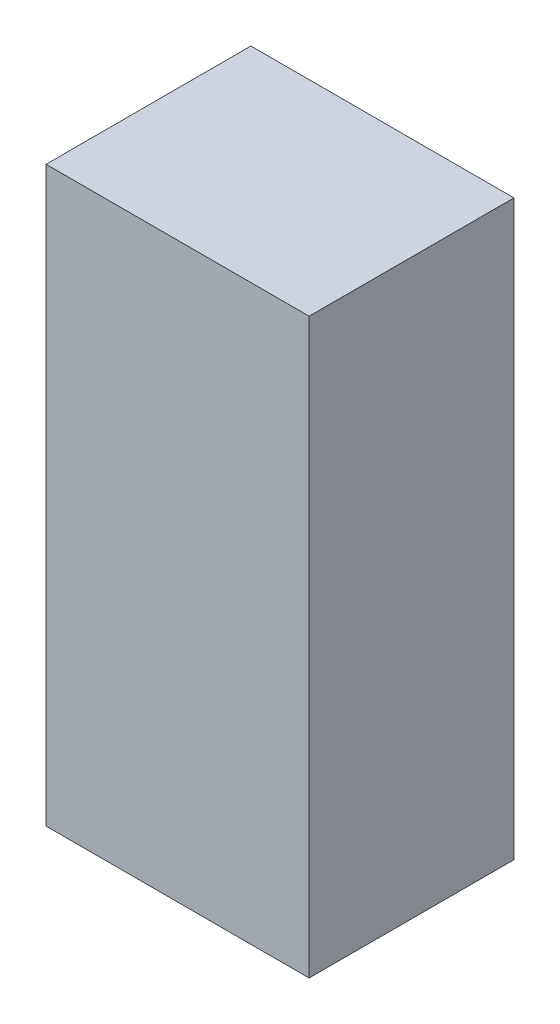
ISO-10303-21;
HEADER;
FILE_DESCRIPTION(('STEP AP214'),'2;1');
FILE_NAME('part.step','',(''),(''),'','','');
FILE_SCHEMA(('AUTOMOTIVE_DESIGN { 1 0 10303 214 1 1 1 1 }'));
ENDSEC;
DATA;
#1=APPLICATION_CONTEXT('core data for automotive mechanical design processes');
#2=APPLICATION_PROTOCOL_DEFINITION('international standard','automotive_design',2000,#1);
#3=PRODUCT_CONTEXT('',#1,'mechanical');
#4=PRODUCT('Part','Part','',(#3));
#5=PRODUCT_RELATED_PRODUCT_CATEGORY('part','',(#4));
#6=PRODUCT_DEFINITION_FORMATION('','',#4);
#7=PRODUCT_DEFINITION_CONTEXT('part definition',#1,'design');
#8=PRODUCT_DEFINITION('design','',#6,#7);
#9=PRODUCT_DEFINITION_SHAPE('','',#8);
#10=(LENGTH_UNIT() NAMED_UNIT(*) SI_UNIT(.MILLI.,.METRE.));
#11=(NAMED_UNIT(*) PLANE_ANGLE_UNIT() SI_UNIT($,.RADIAN.));
#12=(NAMED_UNIT(*) SI_UNIT($,.STERADIAN.) SOLID_ANGLE_UNIT());
#13=UNCERTAINTY_MEASURE_WITH_UNIT(LENGTH_MEASURE(1.E-05),#10,'distance_accuracy_value','');
#14=(GEOMETRIC_REPRESENTATION_CONTEXT(3) GLOBAL_UNCERTAINTY_ASSIGNED_CONTEXT((#13)) GLOBAL_UNIT_ASSIGNED_CONTEXT((#10,
#11,#12)) REPRESENTATION_CONTEXT('',''));
#15=CARTESIAN_POINT('',(0.,0.,0.));
#16=DIRECTION('',(0.,0.,1.));
#17=DIRECTION('',(1.,0.,0.));
#18=AXIS2_PLACEMENT_3D('',#15,#16,#17);
#19=CARTESIAN_POINT('',(-0.6999986,1.52500076,1.09000036));
#20=DIRECTION('',(0.,0.,-1.));
#21=DIRECTION('',(-1.,0.,0.));
#22=AXIS2_PLACEMENT_3D('',#19,#20,#21);
#23=PLANE('',#22);
#24=DIRECTION('',(1.,0.,0.));
#25=VECTOR('',#24,1.);
#26=CARTESIAN_POINT('',(-0.6999986,-1.52499822,1.09000036));
#27=LINE('',#26,#25);
#28=CARTESIAN_POINT('',(-0.6999986,-1.52499822,1.09000036));
#29=VERTEX_POINT('',#28);
#30=CARTESIAN_POINT('',(0.70000114,-1.52499822,1.09000036));
#31=VERTEX_POINT('',#30);
#32=EDGE_CURVE('E55',#29,#31,#27,.T.);
#33=ORIENTED_EDGE('',*,*,#32,.T.);
#34=DIRECTION('',(0.,1.,0.));
#35=VECTOR('',#34,1.);
#36=CARTESIAN_POINT('',(0.70000114,-1.52499822,1.09000036));
#37=LINE('',#36,#35);
#38=CARTESIAN_POINT('',(0.70000114,1.52500076,1.09000036));
#39=VERTEX_POINT('',#38);
#40=EDGE_CURVE('E57',#31,#39,#37,.T.);
#41=ORIENTED_EDGE('',*,*,#40,.T.);
#42=DIRECTION('',(1.,0.,0.));
#43=VECTOR('',#42,1.);
#44=CARTESIAN_POINT('',(0.70000114,1.52500076,1.09000036));
#45=LINE('',#44,#43);
#46=CARTESIAN_POINT('',(-0.6999986,1.52500076,1.09000036));
#47=VERTEX_POINT('',#46);
#48=EDGE_CURVE('E20',#39,#47,#45,.F.);
#49=ORIENTED_EDGE('',*,*,#48,.T.);
#50=DIRECTION('',(0.,1.,0.));
#51=VECTOR('',#50,1.);
#52=CARTESIAN_POINT('',(-0.6999986,1.52500076,1.09000036));
#53=LINE('',#52,#51);
#54=EDGE_CURVE('E80',#47,#29,#53,.F.);
#55=ORIENTED_EDGE('',*,*,#54,.T.);
#56=EDGE_LOOP('',(#33,#41,#49,#55));
#57=FACE_BOUND('',#56,.T.);
#58=ADVANCED_FACE('F17',(#57),#23,.F.);
#59=CARTESIAN_POINT('',(0.70000114,1.52500076,0.));
#60=DIRECTION('',(0.,-1.,0.));
#61=DIRECTION('',(0.,0.,-1.));
#62=AXIS2_PLACEMENT_3D('',#59,#60,#61);
#63=PLANE('',#62);
#64=DIRECTION('',(0.,0.,-1.));
#65=VECTOR('',#64,1.);
#66=CARTESIAN_POINT('',(-0.6999986,1.52500076,0.));
#67=LINE('',#66,#65);
#68=CARTESIAN_POINT('',(-0.6999986,1.52500076,0.));
#69=VERTEX_POINT('',#68);
#70=EDGE_CURVE('E68',#69,#47,#67,.F.);
#71=ORIENTED_EDGE('',*,*,#70,.T.);
#72=ORIENTED_EDGE('',*,*,#48,.F.);
#73=DIRECTION('',(0.,0.,1.));
#74=VECTOR('',#73,1.);
#75=CARTESIAN_POINT('',(0.70000114,1.52500076,0.));
#76=LINE('',#75,#74);
#77=CARTESIAN_POINT('',(0.70000114,1.52500076,0.));
#78=VERTEX_POINT('',#77);
#79=EDGE_CURVE('E63',#39,#78,#76,.F.);
#80=ORIENTED_EDGE('',*,*,#79,.T.);
#81=DIRECTION('',(-1.,0.,0.));
#82=VECTOR('',#81,1.);
#83=CARTESIAN_POINT('',(-0.6999986,1.52500076,0.));
#84=LINE('',#83,#82);
#85=EDGE_CURVE('E83',#69,#78,#84,.F.);
#86=ORIENTED_EDGE('',*,*,#85,.F.);
#87=EDGE_LOOP('',(#71,#72,#80,#86));
#88=FACE_BOUND('',#87,.T.);
#89=ADVANCED_FACE('F65',(#88),#63,.F.);
#90=CARTESIAN_POINT('',(0.70000114,-1.52499822,0.));
#91=DIRECTION('',(-1.,0.,0.));
#92=DIRECTION('',(0.,0.,1.));
#93=AXIS2_PLACEMENT_3D('',#90,#91,#92);
#94=PLANE('',#93);
#95=ORIENTED_EDGE('',*,*,#79,.F.);
#96=ORIENTED_EDGE('',*,*,#40,.F.);
#97=DIRECTION('',(0.,0.,1.));
#98=VECTOR('',#97,1.);
#99=CARTESIAN_POINT('',(0.70000114,-1.52499822,0.));
#100=LINE('',#99,#98);
#101=CARTESIAN_POINT('',(0.70000114,-1.52499822,0.));
#102=VERTEX_POINT('',#101);
#103=EDGE_CURVE('E75',#31,#102,#100,.F.);
#104=ORIENTED_EDGE('',*,*,#103,.T.);
#105=DIRECTION('',(0.,1.,0.));
#106=VECTOR('',#105,1.);
#107=CARTESIAN_POINT('',(0.70000114,1.52500076,0.));
#108=LINE('',#107,#106);
#109=EDGE_CURVE('E72',#78,#102,#108,.F.);
#110=ORIENTED_EDGE('',*,*,#109,.F.);
#111=EDGE_LOOP('',(#95,#96,#104,#110));
#112=FACE_BOUND('',#111,.T.);
#113=ADVANCED_FACE('F70',(#112),#94,.F.);
#114=CARTESIAN_POINT('',(-0.6999986,-1.52499822,0.));
#115=DIRECTION('',(0.,1.,0.));
#116=DIRECTION('',(0.,0.,1.));
#117=AXIS2_PLACEMENT_3D('',#114,#115,#116);
#118=PLANE('',#117);
#119=ORIENTED_EDGE('',*,*,#103,.F.);
#120=ORIENTED_EDGE('',*,*,#32,.F.);
#121=DIRECTION('',(0.,0.,-1.));
#122=VECTOR('',#121,1.);
#123=CARTESIAN_POINT('',(-0.6999986,-1.52499822,0.));
#124=LINE('',#123,#122);
#125=CARTESIAN_POINT('',(-0.6999986,-1.52499822,0.));
#126=VERTEX_POINT('',#125);
#127=EDGE_CURVE('E35',#29,#126,#124,.T.);
#128=ORIENTED_EDGE('',*,*,#127,.T.);
#129=DIRECTION('',(-1.,0.,0.));
#130=VECTOR('',#129,1.);
#131=CARTESIAN_POINT('',(-0.6999986,-1.52499822,0.));
#132=LINE('',#131,#130);
#133=EDGE_CURVE('E26',#102,#126,#132,.T.);
#134=ORIENTED_EDGE('',*,*,#133,.F.);
#135=EDGE_LOOP('',(#119,#120,#128,#134));
#136=FACE_BOUND('',#135,.T.);
#137=ADVANCED_FACE('F89',(#136),#118,.F.);
#138=CARTESIAN_POINT('',(-0.6999986,1.52500076,0.));
#139=DIRECTION('',(1.,0.,0.));
#140=DIRECTION('',(0.,0.,-1.));
#141=AXIS2_PLACEMENT_3D('',#138,#139,#140);
#142=PLANE('',#141);
#143=ORIENTED_EDGE('',*,*,#127,.F.);
#144=ORIENTED_EDGE('',*,*,#54,.F.);
#145=ORIENTED_EDGE('',*,*,#70,.F.);
#146=DIRECTION('',(0.,1.,0.));
#147=VECTOR('',#146,1.);
#148=CARTESIAN_POINT('',(-0.6999986,1.52500076,0.));
#149=LINE('',#148,#147);
#150=EDGE_CURVE('E11',#126,#69,#149,.T.);
#151=ORIENTED_EDGE('',*,*,#150,.F.);
#152=EDGE_LOOP('',(#143,#144,#145,#151));
#153=FACE_BOUND('',#152,.T.);
#154=ADVANCED_FACE('F91',(#153),#142,.F.);
#155=CARTESIAN_POINT('',(-0.6999986,1.52500076,0.));
#156=DIRECTION('',(0.,0.,-1.));
#157=DIRECTION('',(-1.,0.,0.));
#158=AXIS2_PLACEMENT_3D('',#155,#156,#157);
#159=PLANE('',#158);
#160=ORIENTED_EDGE('',*,*,#133,.T.);
#161=ORIENTED_EDGE('',*,*,#150,.T.);
#162=ORIENTED_EDGE('',*,*,#85,.T.);
#163=ORIENTED_EDGE('',*,*,#109,.T.);
#164=EDGE_LOOP('',(#160,#161,#162,#163));
#165=FACE_BOUND('',#164,.T.);
#166=ADVANCED_FACE('F88',(#165),#159,.T.);
#167=CLOSED_SHELL('',(#58,#89,#113,#137,#154,#166));
#168=MANIFOLD_SOLID_BREP('B1',#167);
#169=ADVANCED_BREP_SHAPE_REPRESENTATION('',(#18,#168),#14);
#170=SHAPE_DEFINITION_REPRESENTATION(#9,#169);
ENDSEC;
END-ISO-10303-21;
